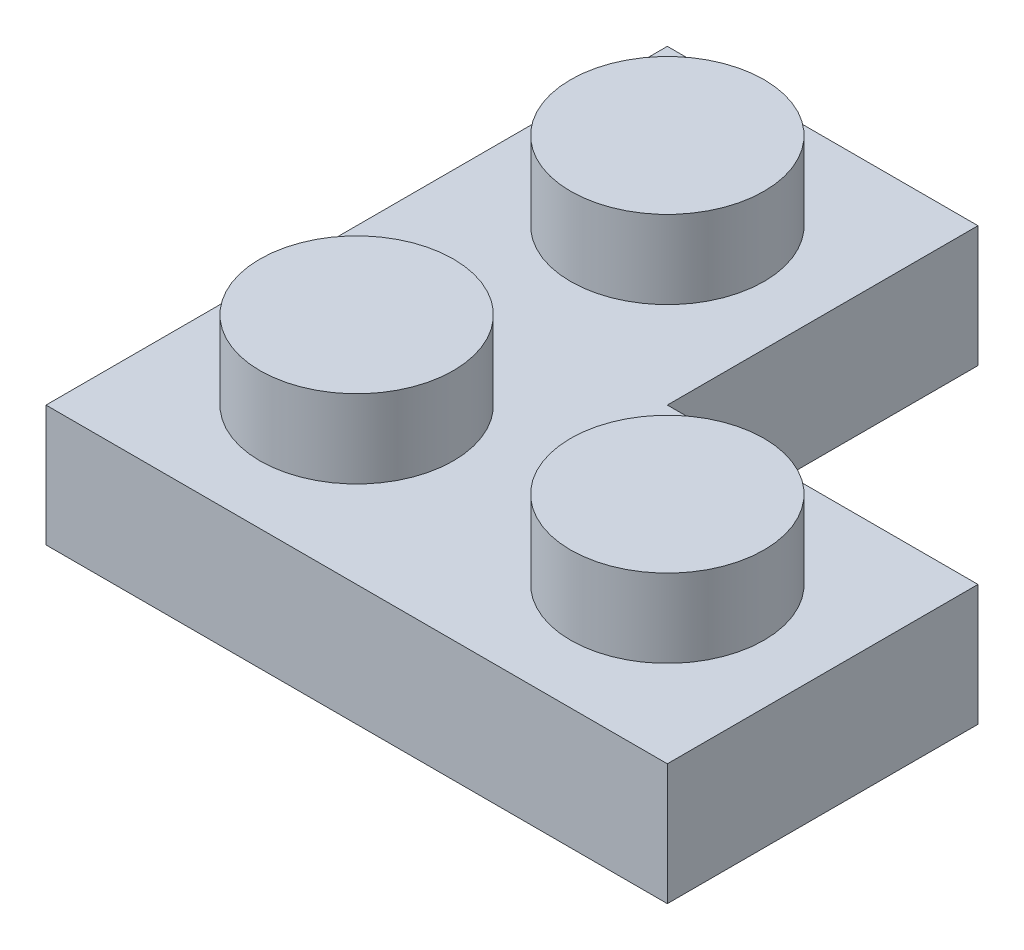
ISO-10303-21;
HEADER;
FILE_DESCRIPTION(('STEP AP214'),'2;1');
FILE_NAME('part.step','',(''),(''),'','','');
FILE_SCHEMA(('AUTOMOTIVE_DESIGN { 1 0 10303 214 1 1 1 1 }'));
ENDSEC;
DATA;
#1=APPLICATION_CONTEXT('core data for automotive mechanical design processes');
#2=APPLICATION_PROTOCOL_DEFINITION('international standard','automotive_design',2000,#1);
#3=PRODUCT_CONTEXT('',#1,'mechanical');
#4=PRODUCT('Part','Part','',(#3));
#5=PRODUCT_RELATED_PRODUCT_CATEGORY('part','',(#4));
#6=PRODUCT_DEFINITION_FORMATION('','',#4);
#7=PRODUCT_DEFINITION_CONTEXT('part definition',#1,'design');
#8=PRODUCT_DEFINITION('design','',#6,#7);
#9=PRODUCT_DEFINITION_SHAPE('','',#8);
#10=(LENGTH_UNIT() NAMED_UNIT(*) SI_UNIT(.MILLI.,.METRE.));
#11=(NAMED_UNIT(*) PLANE_ANGLE_UNIT() SI_UNIT($,.RADIAN.));
#12=(NAMED_UNIT(*) SI_UNIT($,.STERADIAN.) SOLID_ANGLE_UNIT());
#13=UNCERTAINTY_MEASURE_WITH_UNIT(LENGTH_MEASURE(1.E-05),#10,'distance_accuracy_value','');
#14=(GEOMETRIC_REPRESENTATION_CONTEXT(3) GLOBAL_UNCERTAINTY_ASSIGNED_CONTEXT((#13)) GLOBAL_UNIT_ASSIGNED_CONTEXT((#10,
#11,#12)) REPRESENTATION_CONTEXT('',''));
#15=CARTESIAN_POINT('',(0.,0.,0.));
#16=DIRECTION('',(0.,0.,1.));
#17=DIRECTION('',(1.,0.,0.));
#18=AXIS2_PLACEMENT_3D('',#15,#16,#17);
#19=CARTESIAN_POINT('',(0.,3.1,15.9));
#20=DIRECTION('',(0.,1.,0.));
#21=DIRECTION('',(0.,0.,1.));
#22=AXIS2_PLACEMENT_3D('',#19,#20,#21);
#23=PLANE('',#22);
#24=CARTESIAN_POINT('',(3.975,3.1,11.925));
#25=DIRECTION('',(0.,1.,0.));
#26=DIRECTION('',(0.,0.,1.));
#27=AXIS2_PLACEMENT_3D('',#24,#25,#26);
#28=CIRCLE('',#27,2.475);
#29=CARTESIAN_POINT('',(3.975,3.1,14.4));
#30=VERTEX_POINT('',#29);
#31=EDGE_CURVE('E164',#30,#30,#28,.T.);
#32=ORIENTED_EDGE('',*,*,#31,.F.);
#33=EDGE_LOOP('',(#32));
#34=FACE_BOUND('',#33,.T.);
#35=DIRECTION('',(0.,0.,1.));
#36=VECTOR('',#35,1.);
#37=CARTESIAN_POINT('',(0.,3.1,0.));
#38=LINE('',#37,#36);
#39=CARTESIAN_POINT('',(0.,3.1,0.));
#40=VERTEX_POINT('',#39);
#41=CARTESIAN_POINT('',(0.,3.1,15.9));
#42=VERTEX_POINT('',#41);
#43=EDGE_CURVE('E141',#40,#42,#38,.T.);
#44=ORIENTED_EDGE('',*,*,#43,.T.);
#45=DIRECTION('',(1.,0.,0.));
#46=VECTOR('',#45,1.);
#47=CARTESIAN_POINT('',(0.,3.1,15.9));
#48=LINE('',#47,#46);
#49=CARTESIAN_POINT('',(15.9,3.1,15.9));
#50=VERTEX_POINT('',#49);
#51=EDGE_CURVE('E91',#42,#50,#48,.T.);
#52=ORIENTED_EDGE('',*,*,#51,.T.);
#53=DIRECTION('',(0.,0.,-1.));
#54=VECTOR('',#53,1.);
#55=CARTESIAN_POINT('',(15.9,3.1,7.95));
#56=LINE('',#55,#54);
#57=CARTESIAN_POINT('',(15.9,3.1,7.95));
#58=VERTEX_POINT('',#57);
#59=EDGE_CURVE('E108',#50,#58,#56,.T.);
#60=ORIENTED_EDGE('',*,*,#59,.T.);
#61=DIRECTION('',(-1.,0.,0.));
#62=VECTOR('',#61,1.);
#63=CARTESIAN_POINT('',(15.9,3.1,7.95));
#64=LINE('',#63,#62);
#65=CARTESIAN_POINT('',(7.95,3.1,7.95));
#66=VERTEX_POINT('',#65);
#67=EDGE_CURVE('E101',#58,#66,#64,.T.);
#68=ORIENTED_EDGE('',*,*,#67,.T.);
#69=DIRECTION('',(0.,0.,-1.));
#70=VECTOR('',#69,1.);
#71=CARTESIAN_POINT('',(7.95,3.1,0.));
#72=LINE('',#71,#70);
#73=CARTESIAN_POINT('',(7.95,3.1,0.));
#74=VERTEX_POINT('',#73);
#75=EDGE_CURVE('E105',#66,#74,#72,.T.);
#76=ORIENTED_EDGE('',*,*,#75,.T.);
#77=DIRECTION('',(-1.,0.,0.));
#78=VECTOR('',#77,1.);
#79=CARTESIAN_POINT('',(0.,3.1,0.));
#80=LINE('',#79,#78);
#81=EDGE_CURVE('E56',#74,#40,#80,.T.);
#82=ORIENTED_EDGE('',*,*,#81,.T.);
#83=EDGE_LOOP('',(#44,#52,#60,#68,#76,#82));
#84=FACE_BOUND('',#83,.T.);
#85=CARTESIAN_POINT('',(3.975,3.1,3.975));
#86=DIRECTION('',(0.,1.,0.));
#87=DIRECTION('',(0.,0.,1.));
#88=AXIS2_PLACEMENT_3D('',#85,#86,#87);
#89=CIRCLE('',#88,2.475);
#90=CARTESIAN_POINT('',(3.975,3.1,6.45));
#91=VERTEX_POINT('',#90);
#92=EDGE_CURVE('E158',#91,#91,#89,.T.);
#93=ORIENTED_EDGE('',*,*,#92,.F.);
#94=EDGE_LOOP('',(#93));
#95=FACE_BOUND('',#94,.T.);
#96=CARTESIAN_POINT('',(11.925,3.1,11.925));
#97=DIRECTION('',(0.,1.,0.));
#98=DIRECTION('',(0.,0.,1.));
#99=AXIS2_PLACEMENT_3D('',#96,#97,#98);
#100=CIRCLE('',#99,2.475);
#101=CARTESIAN_POINT('',(11.925,3.1,14.4));
#102=VERTEX_POINT('',#101);
#103=EDGE_CURVE('E170',#102,#102,#100,.T.);
#104=ORIENTED_EDGE('',*,*,#103,.F.);
#105=EDGE_LOOP('',(#104));
#106=FACE_BOUND('',#105,.T.);
#107=ADVANCED_FACE('F32',(#34,#84,#95,#106),#23,.T.);
#108=CARTESIAN_POINT('',(0.,3.1,0.));
#109=DIRECTION('',(1.,0.,0.));
#110=DIRECTION('',(0.,0.,-1.));
#111=AXIS2_PLACEMENT_3D('',#108,#109,#110);
#112=PLANE('',#111);
#113=DIRECTION('',(0.,0.,1.));
#114=VECTOR('',#113,1.);
#115=CARTESIAN_POINT('',(0.,0.,0.));
#116=LINE('',#115,#114);
#117=CARTESIAN_POINT('',(0.,0.,0.));
#118=VERTEX_POINT('',#117);
#119=CARTESIAN_POINT('',(0.,0.,15.9));
#120=VERTEX_POINT('',#119);
#121=EDGE_CURVE('E129',#118,#120,#116,.T.);
#122=ORIENTED_EDGE('',*,*,#121,.T.);
#123=DIRECTION('',(0.,-1.,0.));
#124=VECTOR('',#123,1.);
#125=CARTESIAN_POINT('',(0.,3.1,15.9));
#126=LINE('',#125,#124);
#127=EDGE_CURVE('E11',#42,#120,#126,.T.);
#128=ORIENTED_EDGE('',*,*,#127,.F.);
#129=ORIENTED_EDGE('',*,*,#43,.F.);
#130=DIRECTION('',(0.,-1.,0.));
#131=VECTOR('',#130,1.);
#132=CARTESIAN_POINT('',(0.,3.1,0.));
#133=LINE('',#132,#131);
#134=EDGE_CURVE('E125',#40,#118,#133,.T.);
#135=ORIENTED_EDGE('',*,*,#134,.T.);
#136=EDGE_LOOP('',(#122,#128,#129,#135));
#137=FACE_BOUND('',#136,.T.);
#138=ADVANCED_FACE('F34',(#137),#112,.F.);
#139=CARTESIAN_POINT('',(0.,3.1,15.9));
#140=DIRECTION('',(0.,0.,-1.));
#141=DIRECTION('',(-1.,0.,0.));
#142=AXIS2_PLACEMENT_3D('',#139,#140,#141);
#143=PLANE('',#142);
#144=DIRECTION('',(1.,0.,0.));
#145=VECTOR('',#144,1.);
#146=CARTESIAN_POINT('',(0.,0.,15.9));
#147=LINE('',#146,#145);
#148=CARTESIAN_POINT('',(15.9,0.,15.9));
#149=VERTEX_POINT('',#148);
#150=EDGE_CURVE('E132',#120,#149,#147,.T.);
#151=ORIENTED_EDGE('',*,*,#150,.T.);
#152=DIRECTION('',(0.,-1.,0.));
#153=VECTOR('',#152,1.);
#154=CARTESIAN_POINT('',(15.9,3.1,15.9));
#155=LINE('',#154,#153);
#156=EDGE_CURVE('E40',#50,#149,#155,.T.);
#157=ORIENTED_EDGE('',*,*,#156,.F.);
#158=ORIENTED_EDGE('',*,*,#51,.F.);
#159=ORIENTED_EDGE('',*,*,#127,.T.);
#160=EDGE_LOOP('',(#151,#157,#158,#159));
#161=FACE_BOUND('',#160,.T.);
#162=ADVANCED_FACE('F286',(#161),#143,.F.);
#163=CARTESIAN_POINT('',(15.9,3.1,7.95));
#164=DIRECTION('',(-1.,0.,0.));
#165=DIRECTION('',(0.,0.,1.));
#166=AXIS2_PLACEMENT_3D('',#163,#164,#165);
#167=PLANE('',#166);
#168=DIRECTION('',(0.,0.,-1.));
#169=VECTOR('',#168,1.);
#170=CARTESIAN_POINT('',(15.9,0.,7.95));
#171=LINE('',#170,#169);
#172=CARTESIAN_POINT('',(15.9,0.,7.95));
#173=VERTEX_POINT('',#172);
#174=EDGE_CURVE('E135',#149,#173,#171,.T.);
#175=ORIENTED_EDGE('',*,*,#174,.T.);
#176=DIRECTION('',(0.,-1.,0.));
#177=VECTOR('',#176,1.);
#178=CARTESIAN_POINT('',(15.9,3.1,7.95));
#179=LINE('',#178,#177);
#180=EDGE_CURVE('E120',#58,#173,#179,.T.);
#181=ORIENTED_EDGE('',*,*,#180,.F.);
#182=ORIENTED_EDGE('',*,*,#59,.F.);
#183=ORIENTED_EDGE('',*,*,#156,.T.);
#184=EDGE_LOOP('',(#175,#181,#182,#183));
#185=FACE_BOUND('',#184,.T.);
#186=ADVANCED_FACE('F147',(#185),#167,.F.);
#187=CARTESIAN_POINT('',(15.9,3.1,7.95));
#188=DIRECTION('',(0.,0.,1.));
#189=DIRECTION('',(1.,0.,0.));
#190=AXIS2_PLACEMENT_3D('',#187,#188,#189);
#191=PLANE('',#190);
#192=DIRECTION('',(-1.,0.,0.));
#193=VECTOR('',#192,1.);
#194=CARTESIAN_POINT('',(15.9,0.,7.95));
#195=LINE('',#194,#193);
#196=CARTESIAN_POINT('',(7.95,0.,7.95));
#197=VERTEX_POINT('',#196);
#198=EDGE_CURVE('E117',#173,#197,#195,.T.);
#199=ORIENTED_EDGE('',*,*,#198,.T.);
#200=DIRECTION('',(0.,-1.,0.));
#201=VECTOR('',#200,1.);
#202=CARTESIAN_POINT('',(7.95,3.1,7.95));
#203=LINE('',#202,#201);
#204=EDGE_CURVE('E114',#66,#197,#203,.T.);
#205=ORIENTED_EDGE('',*,*,#204,.F.);
#206=ORIENTED_EDGE('',*,*,#67,.F.);
#207=ORIENTED_EDGE('',*,*,#180,.T.);
#208=EDGE_LOOP('',(#199,#205,#206,#207));
#209=FACE_BOUND('',#208,.T.);
#210=ADVANCED_FACE('F115',(#209),#191,.F.);
#211=CARTESIAN_POINT('',(7.95,3.1,0.));
#212=DIRECTION('',(-1.,0.,0.));
#213=DIRECTION('',(0.,0.,1.));
#214=AXIS2_PLACEMENT_3D('',#211,#212,#213);
#215=PLANE('',#214);
#216=DIRECTION('',(0.,0.,-1.));
#217=VECTOR('',#216,1.);
#218=CARTESIAN_POINT('',(7.95,0.,0.));
#219=LINE('',#218,#217);
#220=CARTESIAN_POINT('',(7.95,0.,0.));
#221=VERTEX_POINT('',#220);
#222=EDGE_CURVE('E138',#197,#221,#219,.T.);
#223=ORIENTED_EDGE('',*,*,#222,.T.);
#224=DIRECTION('',(0.,-1.,0.));
#225=VECTOR('',#224,1.);
#226=CARTESIAN_POINT('',(7.95,3.1,0.));
#227=LINE('',#226,#225);
#228=EDGE_CURVE('E121',#74,#221,#227,.T.);
#229=ORIENTED_EDGE('',*,*,#228,.F.);
#230=ORIENTED_EDGE('',*,*,#75,.F.);
#231=ORIENTED_EDGE('',*,*,#204,.T.);
#232=EDGE_LOOP('',(#223,#229,#230,#231));
#233=FACE_BOUND('',#232,.T.);
#234=ADVANCED_FACE('F123',(#233),#215,.F.);
#235=CARTESIAN_POINT('',(0.,3.1,0.));
#236=DIRECTION('',(0.,0.,1.));
#237=DIRECTION('',(1.,0.,0.));
#238=AXIS2_PLACEMENT_3D('',#235,#236,#237);
#239=PLANE('',#238);
#240=DIRECTION('',(-1.,0.,0.));
#241=VECTOR('',#240,1.);
#242=CARTESIAN_POINT('',(0.,0.,0.));
#243=LINE('',#242,#241);
#244=EDGE_CURVE('E83',#221,#118,#243,.T.);
#245=ORIENTED_EDGE('',*,*,#244,.T.);
#246=ORIENTED_EDGE('',*,*,#134,.F.);
#247=ORIENTED_EDGE('',*,*,#81,.F.);
#248=ORIENTED_EDGE('',*,*,#228,.T.);
#249=EDGE_LOOP('',(#245,#246,#247,#248));
#250=FACE_BOUND('',#249,.T.);
#251=ADVANCED_FACE('F151',(#250),#239,.F.);
#252=CARTESIAN_POINT('',(0.,0.,15.9));
#253=DIRECTION('',(0.,1.,0.));
#254=DIRECTION('',(0.,0.,1.));
#255=AXIS2_PLACEMENT_3D('',#252,#253,#254);
#256=PLANE('',#255);
#257=DIRECTION('',(0.,0.,-1.));
#258=VECTOR('',#257,1.);
#259=CARTESIAN_POINT('',(1.5,0.,14.4));
#260=LINE('',#259,#258);
#261=CARTESIAN_POINT('',(1.5,0.,14.4));
#262=VERTEX_POINT('',#261);
#263=CARTESIAN_POINT('',(1.5,0.,1.5));
#264=VERTEX_POINT('',#263);
#265=EDGE_CURVE('E205',#262,#264,#260,.T.);
#266=ORIENTED_EDGE('',*,*,#265,.F.);
#267=DIRECTION('',(-1.,0.,0.));
#268=VECTOR('',#267,1.);
#269=CARTESIAN_POINT('',(14.4,0.,14.4));
#270=LINE('',#269,#268);
#271=CARTESIAN_POINT('',(14.4,0.,14.4));
#272=VERTEX_POINT('',#271);
#273=EDGE_CURVE('E47',#272,#262,#270,.T.);
#274=ORIENTED_EDGE('',*,*,#273,.F.);
#275=DIRECTION('',(0.,0.,1.));
#276=VECTOR('',#275,1.);
#277=CARTESIAN_POINT('',(14.4,0.,9.45));
#278=LINE('',#277,#276);
#279=CARTESIAN_POINT('',(14.4,0.,9.45));
#280=VERTEX_POINT('',#279);
#281=EDGE_CURVE('E192',#280,#272,#278,.T.);
#282=ORIENTED_EDGE('',*,*,#281,.F.);
#283=DIRECTION('',(1.,0.,0.));
#284=VECTOR('',#283,1.);
#285=CARTESIAN_POINT('',(6.45,0.,9.45));
#286=LINE('',#285,#284);
#287=CARTESIAN_POINT('',(6.45,0.,9.45));
#288=VERTEX_POINT('',#287);
#289=EDGE_CURVE('E196',#288,#280,#286,.T.);
#290=ORIENTED_EDGE('',*,*,#289,.F.);
#291=DIRECTION('',(0.,0.,1.));
#292=VECTOR('',#291,1.);
#293=CARTESIAN_POINT('',(6.45,0.,1.5));
#294=LINE('',#293,#292);
#295=CARTESIAN_POINT('',(6.45,0.,1.5));
#296=VERTEX_POINT('',#295);
#297=EDGE_CURVE('E199',#296,#288,#294,.T.);
#298=ORIENTED_EDGE('',*,*,#297,.F.);
#299=DIRECTION('',(1.,0.,0.));
#300=VECTOR('',#299,1.);
#301=CARTESIAN_POINT('',(1.5,0.,1.5));
#302=LINE('',#301,#300);
#303=EDGE_CURVE('E202',#264,#296,#302,.T.);
#304=ORIENTED_EDGE('',*,*,#303,.F.);
#305=EDGE_LOOP('',(#266,#274,#282,#290,#298,#304));
#306=FACE_BOUND('',#305,.T.);
#307=ORIENTED_EDGE('',*,*,#121,.F.);
#308=ORIENTED_EDGE('',*,*,#244,.F.);
#309=ORIENTED_EDGE('',*,*,#222,.F.);
#310=ORIENTED_EDGE('',*,*,#198,.F.);
#311=ORIENTED_EDGE('',*,*,#174,.F.);
#312=ORIENTED_EDGE('',*,*,#150,.F.);
#313=EDGE_LOOP('',(#307,#308,#309,#310,#311,#312));
#314=FACE_BOUND('',#313,.T.);
#315=ADVANCED_FACE('F150',(#306,#314),#256,.F.);
#316=CARTESIAN_POINT('',(3.975,5.1,3.975));
#317=DIRECTION('',(0.,-1.,0.));
#318=DIRECTION('',(0.,0.,-1.));
#319=AXIS2_PLACEMENT_3D('',#316,#317,#318);
#320=CYLINDRICAL_SURFACE('',#319,2.475);
#321=CARTESIAN_POINT('',(3.975,5.1,3.975));
#322=DIRECTION('',(0.,1.,0.));
#323=DIRECTION('',(0.,0.,1.));
#324=AXIS2_PLACEMENT_3D('',#321,#322,#323);
#325=CIRCLE('',#324,2.475);
#326=CARTESIAN_POINT('',(3.975,5.1,6.45));
#327=VERTEX_POINT('',#326);
#328=EDGE_CURVE('E133',#327,#327,#325,.T.);
#329=ORIENTED_EDGE('',*,*,#328,.F.);
#330=EDGE_LOOP('',(#329));
#331=FACE_BOUND('',#330,.T.);
#332=ORIENTED_EDGE('',*,*,#92,.T.);
#333=EDGE_LOOP('',(#332));
#334=FACE_BOUND('',#333,.T.);
#335=ADVANCED_FACE('F290',(#331,#334),#320,.T.);
#336=CARTESIAN_POINT('',(3.975,5.1,3.975));
#337=DIRECTION('',(0.,1.,0.));
#338=DIRECTION('',(0.,0.,1.));
#339=AXIS2_PLACEMENT_3D('',#336,#337,#338);
#340=PLANE('',#339);
#341=ORIENTED_EDGE('',*,*,#328,.T.);
#342=EDGE_LOOP('',(#341));
#343=FACE_BOUND('',#342,.T.);
#344=ADVANCED_FACE('F334',(#343),#340,.T.);
#345=CARTESIAN_POINT('',(3.975,5.1,11.925));
#346=DIRECTION('',(0.,-1.,0.));
#347=DIRECTION('',(0.,0.,-1.));
#348=AXIS2_PLACEMENT_3D('',#345,#346,#347);
#349=CYLINDRICAL_SURFACE('',#348,2.475);
#350=CARTESIAN_POINT('',(3.975,5.1,11.925));
#351=DIRECTION('',(0.,1.,0.));
#352=DIRECTION('',(0.,0.,1.));
#353=AXIS2_PLACEMENT_3D('',#350,#351,#352);
#354=CIRCLE('',#353,2.475);
#355=CARTESIAN_POINT('',(3.975,5.1,14.4));
#356=VERTEX_POINT('',#355);
#357=EDGE_CURVE('E161',#356,#356,#354,.T.);
#358=ORIENTED_EDGE('',*,*,#357,.F.);
#359=EDGE_LOOP('',(#358));
#360=FACE_BOUND('',#359,.T.);
#361=ORIENTED_EDGE('',*,*,#31,.T.);
#362=EDGE_LOOP('',(#361));
#363=FACE_BOUND('',#362,.T.);
#364=ADVANCED_FACE('F341',(#360,#363),#349,.T.);
#365=CARTESIAN_POINT('',(3.975,5.1,11.925));
#366=DIRECTION('',(0.,1.,0.));
#367=DIRECTION('',(0.,0.,1.));
#368=AXIS2_PLACEMENT_3D('',#365,#366,#367);
#369=PLANE('',#368);
#370=ORIENTED_EDGE('',*,*,#357,.T.);
#371=EDGE_LOOP('',(#370));
#372=FACE_BOUND('',#371,.T.);
#373=ADVANCED_FACE('F348',(#372),#369,.T.);
#374=CARTESIAN_POINT('',(11.925,5.1,11.925));
#375=DIRECTION('',(0.,-1.,0.));
#376=DIRECTION('',(0.,0.,-1.));
#377=AXIS2_PLACEMENT_3D('',#374,#375,#376);
#378=CYLINDRICAL_SURFACE('',#377,2.475);
#379=CARTESIAN_POINT('',(11.925,5.1,11.925));
#380=DIRECTION('',(0.,1.,0.));
#381=DIRECTION('',(0.,0.,1.));
#382=AXIS2_PLACEMENT_3D('',#379,#380,#381);
#383=CIRCLE('',#382,2.475);
#384=CARTESIAN_POINT('',(11.925,5.1,14.4));
#385=VERTEX_POINT('',#384);
#386=EDGE_CURVE('E167',#385,#385,#383,.T.);
#387=ORIENTED_EDGE('',*,*,#386,.F.);
#388=EDGE_LOOP('',(#387));
#389=FACE_BOUND('',#388,.T.);
#390=ORIENTED_EDGE('',*,*,#103,.T.);
#391=EDGE_LOOP('',(#390));
#392=FACE_BOUND('',#391,.T.);
#393=ADVANCED_FACE('F356',(#389,#392),#378,.T.);
#394=CARTESIAN_POINT('',(11.925,5.1,11.925));
#395=DIRECTION('',(0.,1.,0.));
#396=DIRECTION('',(0.,0.,1.));
#397=AXIS2_PLACEMENT_3D('',#394,#395,#396);
#398=PLANE('',#397);
#399=ORIENTED_EDGE('',*,*,#386,.T.);
#400=EDGE_LOOP('',(#399));
#401=FACE_BOUND('',#400,.T.);
#402=ADVANCED_FACE('F364',(#401),#398,.T.);
#403=CARTESIAN_POINT('',(14.4,2.,14.4));
#404=DIRECTION('',(0.,0.,1.));
#405=DIRECTION('',(1.,0.,0.));
#406=AXIS2_PLACEMENT_3D('',#403,#404,#405);
#407=PLANE('',#406);
#408=ORIENTED_EDGE('',*,*,#273,.T.);
#409=DIRECTION('',(0.,-1.,0.));
#410=VECTOR('',#409,1.);
#411=CARTESIAN_POINT('',(1.5,2.,14.4));
#412=LINE('',#411,#410);
#413=CARTESIAN_POINT('',(1.5,2.,14.4));
#414=VERTEX_POINT('',#413);
#415=EDGE_CURVE('E176',#414,#262,#412,.T.);
#416=ORIENTED_EDGE('',*,*,#415,.F.);
#417=DIRECTION('',(-1.,0.,0.));
#418=VECTOR('',#417,1.);
#419=CARTESIAN_POINT('',(14.4,2.,14.4));
#420=LINE('',#419,#418);
#421=CARTESIAN_POINT('',(14.4,2.,14.4));
#422=VERTEX_POINT('',#421);
#423=EDGE_CURVE('E195',#422,#414,#420,.T.);
#424=ORIENTED_EDGE('',*,*,#423,.F.);
#425=DIRECTION('',(0.,-1.,0.));
#426=VECTOR('',#425,1.);
#427=CARTESIAN_POINT('',(14.4,2.,14.4));
#428=LINE('',#427,#426);
#429=EDGE_CURVE('E173',#422,#272,#428,.T.);
#430=ORIENTED_EDGE('',*,*,#429,.T.);
#431=EDGE_LOOP('',(#408,#416,#424,#430));
#432=FACE_BOUND('',#431,.T.);
#433=ADVANCED_FACE('F232',(#432),#407,.F.);
#434=CARTESIAN_POINT('',(14.4,2.,9.45));
#435=DIRECTION('',(1.,0.,0.));
#436=DIRECTION('',(0.,0.,-1.));
#437=AXIS2_PLACEMENT_3D('',#434,#435,#436);
#438=PLANE('',#437);
#439=ORIENTED_EDGE('',*,*,#281,.T.);
#440=ORIENTED_EDGE('',*,*,#429,.F.);
#441=DIRECTION('',(0.,0.,1.));
#442=VECTOR('',#441,1.);
#443=CARTESIAN_POINT('',(14.4,2.,9.45));
#444=LINE('',#443,#442);
#445=CARTESIAN_POINT('',(14.4,2.,9.45));
#446=VERTEX_POINT('',#445);
#447=EDGE_CURVE('E179',#446,#422,#444,.T.);
#448=ORIENTED_EDGE('',*,*,#447,.F.);
#449=DIRECTION('',(0.,-1.,0.));
#450=VECTOR('',#449,1.);
#451=CARTESIAN_POINT('',(14.4,2.,9.45));
#452=LINE('',#451,#450);
#453=EDGE_CURVE('E188',#446,#280,#452,.T.);
#454=ORIENTED_EDGE('',*,*,#453,.T.);
#455=EDGE_LOOP('',(#439,#440,#448,#454));
#456=FACE_BOUND('',#455,.T.);
#457=ADVANCED_FACE('F248',(#456),#438,.F.);
#458=CARTESIAN_POINT('',(6.45,2.,9.45));
#459=DIRECTION('',(0.,0.,-1.));
#460=DIRECTION('',(-1.,0.,0.));
#461=AXIS2_PLACEMENT_3D('',#458,#459,#460);
#462=PLANE('',#461);
#463=ORIENTED_EDGE('',*,*,#289,.T.);
#464=ORIENTED_EDGE('',*,*,#453,.F.);
#465=DIRECTION('',(1.,0.,0.));
#466=VECTOR('',#465,1.);
#467=CARTESIAN_POINT('',(6.45,2.,9.45));
#468=LINE('',#467,#466);
#469=CARTESIAN_POINT('',(6.45,2.,9.45));
#470=VERTEX_POINT('',#469);
#471=EDGE_CURVE('E211',#470,#446,#468,.T.);
#472=ORIENTED_EDGE('',*,*,#471,.F.);
#473=DIRECTION('',(0.,-1.,0.));
#474=VECTOR('',#473,1.);
#475=CARTESIAN_POINT('',(6.45,2.,9.45));
#476=LINE('',#475,#474);
#477=EDGE_CURVE('E185',#470,#288,#476,.T.);
#478=ORIENTED_EDGE('',*,*,#477,.T.);
#479=EDGE_LOOP('',(#463,#464,#472,#478));
#480=FACE_BOUND('',#479,.T.);
#481=ADVANCED_FACE('F253',(#480),#462,.F.);
#482=CARTESIAN_POINT('',(6.45,2.,1.5));
#483=DIRECTION('',(1.,0.,0.));
#484=DIRECTION('',(0.,0.,-1.));
#485=AXIS2_PLACEMENT_3D('',#482,#483,#484);
#486=PLANE('',#485);
#487=ORIENTED_EDGE('',*,*,#297,.T.);
#488=ORIENTED_EDGE('',*,*,#477,.F.);
#489=DIRECTION('',(0.,0.,1.));
#490=VECTOR('',#489,1.);
#491=CARTESIAN_POINT('',(6.45,2.,1.5));
#492=LINE('',#491,#490);
#493=CARTESIAN_POINT('',(6.45,2.,1.5));
#494=VERTEX_POINT('',#493);
#495=EDGE_CURVE('E214',#494,#470,#492,.T.);
#496=ORIENTED_EDGE('',*,*,#495,.F.);
#497=DIRECTION('',(0.,-1.,0.));
#498=VECTOR('',#497,1.);
#499=CARTESIAN_POINT('',(6.45,2.,1.5));
#500=LINE('',#499,#498);
#501=EDGE_CURVE('E182',#494,#296,#500,.T.);
#502=ORIENTED_EDGE('',*,*,#501,.T.);
#503=EDGE_LOOP('',(#487,#488,#496,#502));
#504=FACE_BOUND('',#503,.T.);
#505=ADVANCED_FACE('F271',(#504),#486,.F.);
#506=CARTESIAN_POINT('',(1.5,2.,1.5));
#507=DIRECTION('',(0.,0.,-1.));
#508=DIRECTION('',(-1.,0.,0.));
#509=AXIS2_PLACEMENT_3D('',#506,#507,#508);
#510=PLANE('',#509);
#511=ORIENTED_EDGE('',*,*,#303,.T.);
#512=ORIENTED_EDGE('',*,*,#501,.F.);
#513=DIRECTION('',(1.,0.,0.));
#514=VECTOR('',#513,1.);
#515=CARTESIAN_POINT('',(1.5,2.,1.5));
#516=LINE('',#515,#514);
#517=CARTESIAN_POINT('',(1.5,2.,1.5));
#518=VERTEX_POINT('',#517);
#519=EDGE_CURVE('E217',#518,#494,#516,.T.);
#520=ORIENTED_EDGE('',*,*,#519,.F.);
#521=DIRECTION('',(0.,-1.,0.));
#522=VECTOR('',#521,1.);
#523=CARTESIAN_POINT('',(1.5,2.,1.5));
#524=LINE('',#523,#522);
#525=EDGE_CURVE('E178',#518,#264,#524,.T.);
#526=ORIENTED_EDGE('',*,*,#525,.T.);
#527=EDGE_LOOP('',(#511,#512,#520,#526));
#528=FACE_BOUND('',#527,.T.);
#529=ADVANCED_FACE('F267',(#528),#510,.F.);
#530=CARTESIAN_POINT('',(1.5,2.,14.4));
#531=DIRECTION('',(-1.,0.,0.));
#532=DIRECTION('',(0.,0.,1.));
#533=AXIS2_PLACEMENT_3D('',#530,#531,#532);
#534=PLANE('',#533);
#535=ORIENTED_EDGE('',*,*,#265,.T.);
#536=ORIENTED_EDGE('',*,*,#525,.F.);
#537=DIRECTION('',(0.,0.,-1.));
#538=VECTOR('',#537,1.);
#539=CARTESIAN_POINT('',(1.5,2.,14.4));
#540=LINE('',#539,#538);
#541=EDGE_CURVE('E220',#414,#518,#540,.T.);
#542=ORIENTED_EDGE('',*,*,#541,.F.);
#543=ORIENTED_EDGE('',*,*,#415,.T.);
#544=EDGE_LOOP('',(#535,#536,#542,#543));
#545=FACE_BOUND('',#544,.T.);
#546=ADVANCED_FACE('F261',(#545),#534,.F.);
#547=CARTESIAN_POINT('',(1.5,2.,14.4));
#548=DIRECTION('',(0.,-1.,0.));
#549=DIRECTION('',(0.,0.,-1.));
#550=AXIS2_PLACEMENT_3D('',#547,#548,#549);
#551=PLANE('',#550);
#552=ORIENTED_EDGE('',*,*,#423,.T.);
#553=ORIENTED_EDGE('',*,*,#541,.T.);
#554=ORIENTED_EDGE('',*,*,#519,.T.);
#555=ORIENTED_EDGE('',*,*,#495,.T.);
#556=ORIENTED_EDGE('',*,*,#471,.T.);
#557=ORIENTED_EDGE('',*,*,#447,.T.);
#558=EDGE_LOOP('',(#552,#553,#554,#555,#556,#557));
#559=FACE_BOUND('',#558,.T.);
#560=ADVANCED_FACE('F227',(#559),#551,.T.);
#561=CLOSED_SHELL('',(#107,#138,#162,#186,#210,#234,#251,#315,#335,#344,#364,#373,#393,#402,
#433,#457,#481,#505,#529,#546,#560));
#562=MANIFOLD_SOLID_BREP('B2',#561);
#563=ADVANCED_BREP_SHAPE_REPRESENTATION('',(#18,#562),#14);
#564=SHAPE_DEFINITION_REPRESENTATION(#9,#563);
ENDSEC;
END-ISO-10303-21;
